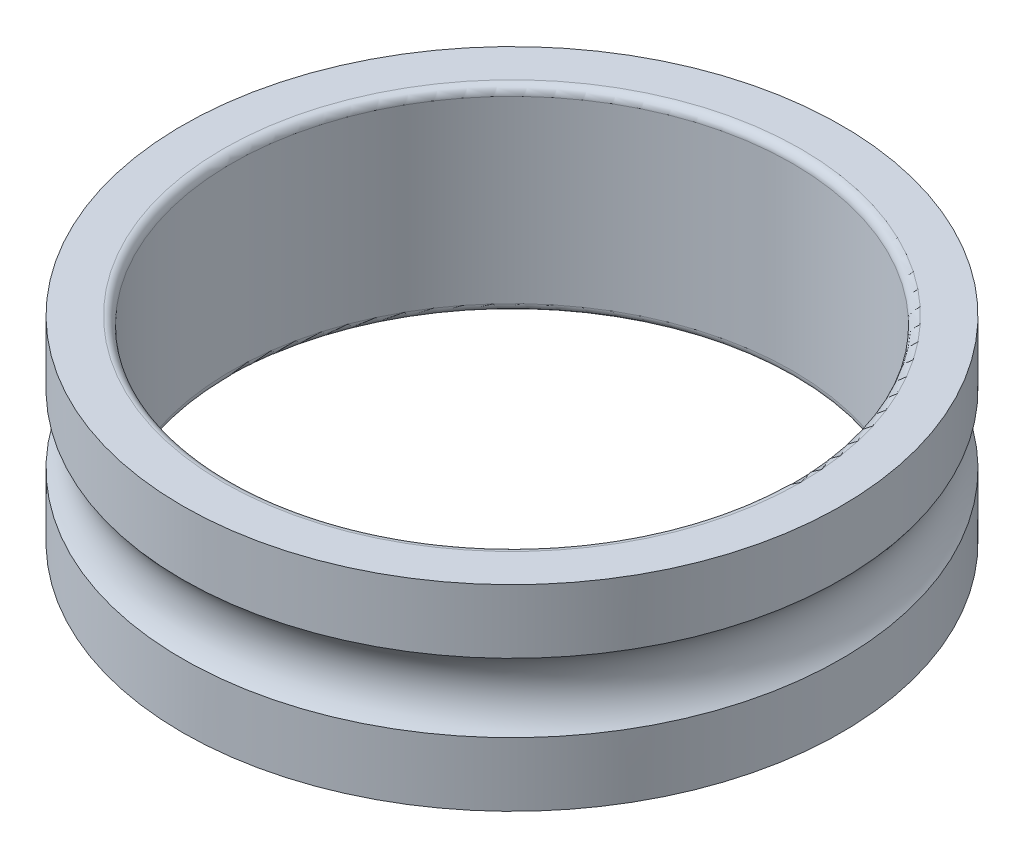
ISO-10303-21;
HEADER;
FILE_DESCRIPTION(('STEP AP214'),'2;1');
FILE_NAME('part.step','',(''),(''),'','','');
FILE_SCHEMA(('AUTOMOTIVE_DESIGN { 1 0 10303 214 1 1 1 1 }'));
ENDSEC;
DATA;
#1=APPLICATION_CONTEXT('core data for automotive mechanical design processes');
#2=APPLICATION_PROTOCOL_DEFINITION('international standard','automotive_design',2000,#1);
#3=PRODUCT_CONTEXT('',#1,'mechanical');
#4=PRODUCT('Part','Part','',(#3));
#5=PRODUCT_RELATED_PRODUCT_CATEGORY('part','',(#4));
#6=PRODUCT_DEFINITION_FORMATION('','',#4);
#7=PRODUCT_DEFINITION_CONTEXT('part definition',#1,'design');
#8=PRODUCT_DEFINITION('design','',#6,#7);
#9=PRODUCT_DEFINITION_SHAPE('','',#8);
#10=(LENGTH_UNIT() NAMED_UNIT(*) SI_UNIT(.MILLI.,.METRE.));
#11=(NAMED_UNIT(*) PLANE_ANGLE_UNIT() SI_UNIT($,.RADIAN.));
#12=(NAMED_UNIT(*) SI_UNIT($,.STERADIAN.) SOLID_ANGLE_UNIT());
#13=UNCERTAINTY_MEASURE_WITH_UNIT(LENGTH_MEASURE(1.E-05),#10,'distance_accuracy_value','');
#14=(GEOMETRIC_REPRESENTATION_CONTEXT(3) GLOBAL_UNCERTAINTY_ASSIGNED_CONTEXT((#13)) GLOBAL_UNIT_ASSIGNED_CONTEXT((#10,
#11,#12)) REPRESENTATION_CONTEXT('',''));
#15=CARTESIAN_POINT('',(0.,0.,0.));
#16=DIRECTION('',(0.,0.,1.));
#17=DIRECTION('',(1.,0.,0.));
#18=AXIS2_PLACEMENT_3D('',#15,#16,#17);
#19=CARTESIAN_POINT('',(0.,-3.5,0.));
#20=DIRECTION('',(0.,1.,0.));
#21=DIRECTION('',(1.,0.,0.));
#22=AXIS2_PLACEMENT_3D('',#19,#20,#21);
#23=PLANE('',#22);
#24=CARTESIAN_POINT('',(0.,-3.5,0.));
#25=DIRECTION('',(0.,-1.,0.));
#26=DIRECTION('',(0.,0.,1.));
#27=AXIS2_PLACEMENT_3D('',#24,#25,#26);
#28=CIRCLE('',#27,10.3);
#29=CARTESIAN_POINT('',(0.,-3.5,-10.3));
#30=VERTEX_POINT('',#29);
#31=EDGE_CURVE('E21',#30,#30,#28,.T.);
#32=ORIENTED_EDGE('',*,*,#31,.F.);
#33=EDGE_LOOP('',(#32));
#34=FACE_BOUND('',#33,.T.);
#35=CARTESIAN_POINT('',(0.,-3.5,0.));
#36=DIRECTION('',(0.,1.,0.));
#37=DIRECTION('',(0.,0.,1.));
#38=AXIS2_PLACEMENT_3D('',#35,#36,#37);
#39=CIRCLE('',#38,11.75);
#40=CARTESIAN_POINT('',(0.,-3.5,11.75));
#41=VERTEX_POINT('',#40);
#42=EDGE_CURVE('E11',#41,#41,#39,.T.);
#43=ORIENTED_EDGE('',*,*,#42,.F.);
#44=EDGE_LOOP('',(#43));
#45=FACE_BOUND('',#44,.T.);
#46=ADVANCED_FACE('F17',(#34,#45),#23,.F.);
#47=CARTESIAN_POINT('',(0.,-3.85,0.));
#48=DIRECTION('',(0.,1.,0.));
#49=DIRECTION('',(0.,0.,-1.));
#50=AXIS2_PLACEMENT_3D('',#47,#48,#49);
#51=CYLINDRICAL_SURFACE('',#50,11.75);
#52=CARTESIAN_POINT('',(0.,-1.224744871392,0.));
#53=DIRECTION('',(0.,-1.,0.));
#54=DIRECTION('',(0.,0.,-1.));
#55=AXIS2_PLACEMENT_3D('',#52,#53,#54);
#56=CIRCLE('',#55,11.75);
#57=CARTESIAN_POINT('',(0.,-1.224744871392,-11.75));
#58=VERTEX_POINT('',#57);
#59=EDGE_CURVE('E28',#58,#58,#56,.T.);
#60=ORIENTED_EDGE('',*,*,#59,.T.);
#61=EDGE_LOOP('',(#60));
#62=FACE_BOUND('',#61,.T.);
#63=ORIENTED_EDGE('',*,*,#42,.T.);
#64=EDGE_LOOP('',(#63));
#65=FACE_BOUND('',#64,.T.);
#66=ADVANCED_FACE('F126',(#62,#65),#51,.T.);
#67=CARTESIAN_POINT('',(0.,0.,0.));
#68=DIRECTION('',(0.,1.,0.));
#69=DIRECTION('',(0.,0.,-1.));
#70=AXIS2_PLACEMENT_3D('',#67,#68,#69);
#71=TOROIDAL_SURFACE('',#70,13.,1.75);
#72=ORIENTED_EDGE('',*,*,#59,.F.);
#73=EDGE_LOOP('',(#72));
#74=FACE_BOUND('',#73,.T.);
#75=CARTESIAN_POINT('',(0.,1.224744871392,0.));
#76=DIRECTION('',(0.,1.,0.));
#77=DIRECTION('',(0.,0.,1.));
#78=AXIS2_PLACEMENT_3D('',#75,#76,#77);
#79=CIRCLE('',#78,11.75);
#80=CARTESIAN_POINT('',(0.,1.224744871392,11.75));
#81=VERTEX_POINT('',#80);
#82=EDGE_CURVE('E85',#81,#81,#79,.T.);
#83=ORIENTED_EDGE('',*,*,#82,.F.);
#84=EDGE_LOOP('',(#83));
#85=FACE_BOUND('',#84,.T.);
#86=ADVANCED_FACE('F149',(#74,#85),#71,.F.);
#87=CARTESIAN_POINT('',(0.,-3.85,0.));
#88=DIRECTION('',(0.,1.,0.));
#89=DIRECTION('',(0.,0.,-1.));
#90=AXIS2_PLACEMENT_3D('',#87,#88,#89);
#91=CYLINDRICAL_SURFACE('',#90,11.75);
#92=CARTESIAN_POINT('',(0.,3.5,0.));
#93=DIRECTION('',(0.,-1.,0.));
#94=DIRECTION('',(0.,0.,1.));
#95=AXIS2_PLACEMENT_3D('',#92,#93,#94);
#96=CIRCLE('',#95,11.75);
#97=CARTESIAN_POINT('',(0.,3.5,11.75));
#98=VERTEX_POINT('',#97);
#99=EDGE_CURVE('E70',#98,#98,#96,.T.);
#100=ORIENTED_EDGE('',*,*,#99,.T.);
#101=EDGE_LOOP('',(#100));
#102=FACE_BOUND('',#101,.T.);
#103=ORIENTED_EDGE('',*,*,#82,.T.);
#104=EDGE_LOOP('',(#103));
#105=FACE_BOUND('',#104,.T.);
#106=ADVANCED_FACE('F19',(#102,#105),#91,.T.);
#107=CARTESIAN_POINT('',(0.,3.5,0.));
#108=DIRECTION('',(0.,1.,0.));
#109=DIRECTION('',(1.,0.,0.));
#110=AXIS2_PLACEMENT_3D('',#107,#108,#109);
#111=PLANE('',#110);
#112=CARTESIAN_POINT('',(0.,3.5,0.));
#113=DIRECTION('',(0.,1.,0.));
#114=DIRECTION('',(0.,0.,1.));
#115=AXIS2_PLACEMENT_3D('',#112,#113,#114);
#116=CIRCLE('',#115,10.3);
#117=CARTESIAN_POINT('',(0.,3.5,10.3));
#118=VERTEX_POINT('',#117);
#119=EDGE_CURVE('E76',#118,#118,#116,.T.);
#120=ORIENTED_EDGE('',*,*,#119,.F.);
#121=EDGE_LOOP('',(#120));
#122=FACE_BOUND('',#121,.T.);
#123=ORIENTED_EDGE('',*,*,#99,.F.);
#124=EDGE_LOOP('',(#123));
#125=FACE_BOUND('',#124,.T.);
#126=ADVANCED_FACE('F111',(#122,#125),#111,.T.);
#127=CARTESIAN_POINT('',(0.,3.2,0.));
#128=DIRECTION('',(0.,1.,0.));
#129=DIRECTION('',(0.,0.,-1.));
#130=AXIS2_PLACEMENT_3D('',#127,#128,#129);
#131=TOROIDAL_SURFACE('',#130,10.3,0.3);
#132=CARTESIAN_POINT('',(0.,3.2,0.));
#133=DIRECTION('',(0.,1.,0.));
#134=DIRECTION('',(0.,0.,1.));
#135=AXIS2_PLACEMENT_3D('',#132,#133,#134);
#136=CIRCLE('',#135,10.);
#137=CARTESIAN_POINT('',(0.,3.2,-10.));
#138=VERTEX_POINT('',#137);
#139=EDGE_CURVE('E80',#138,#138,#136,.T.);
#140=ORIENTED_EDGE('',*,*,#139,.F.);
#141=EDGE_LOOP('',(#140));
#142=FACE_BOUND('',#141,.T.);
#143=ORIENTED_EDGE('',*,*,#119,.T.);
#144=EDGE_LOOP('',(#143));
#145=FACE_BOUND('',#144,.T.);
#146=ADVANCED_FACE('F77',(#142,#145),#131,.T.);
#147=CARTESIAN_POINT('',(0.,-3.85,0.));
#148=DIRECTION('',(0.,1.,0.));
#149=DIRECTION('',(0.,0.,-1.));
#150=AXIS2_PLACEMENT_3D('',#147,#148,#149);
#151=CYLINDRICAL_SURFACE('',#150,10.);
#152=ORIENTED_EDGE('',*,*,#139,.T.);
#153=EDGE_LOOP('',(#152));
#154=FACE_BOUND('',#153,.T.);
#155=CARTESIAN_POINT('',(0.,-3.2,0.));
#156=DIRECTION('',(0.,-1.,0.));
#157=DIRECTION('',(0.,0.,1.));
#158=AXIS2_PLACEMENT_3D('',#155,#156,#157);
#159=CIRCLE('',#158,10.);
#160=CARTESIAN_POINT('',(0.,-3.2,-10.));
#161=VERTEX_POINT('',#160);
#162=EDGE_CURVE('E62',#161,#161,#159,.T.);
#163=ORIENTED_EDGE('',*,*,#162,.T.);
#164=EDGE_LOOP('',(#163));
#165=FACE_BOUND('',#164,.T.);
#166=ADVANCED_FACE('F104',(#154,#165),#151,.F.);
#167=CARTESIAN_POINT('',(0.,-3.2,0.));
#168=DIRECTION('',(0.,1.,0.));
#169=DIRECTION('',(0.,0.,-1.));
#170=AXIS2_PLACEMENT_3D('',#167,#168,#169);
#171=TOROIDAL_SURFACE('',#170,10.3,0.3);
#172=ORIENTED_EDGE('',*,*,#31,.T.);
#173=EDGE_LOOP('',(#172));
#174=FACE_BOUND('',#173,.T.);
#175=ORIENTED_EDGE('',*,*,#162,.F.);
#176=EDGE_LOOP('',(#175));
#177=FACE_BOUND('',#176,.T.);
#178=ADVANCED_FACE('F99',(#174,#177),#171,.T.);
#179=CLOSED_SHELL('',(#46,#66,#86,#106,#126,#146,#166,#178));
#180=MANIFOLD_SOLID_BREP('B1',#179);
#181=ADVANCED_BREP_SHAPE_REPRESENTATION('',(#18,#180),#14);
#182=SHAPE_DEFINITION_REPRESENTATION(#9,#181);
ENDSEC;
END-ISO-10303-21;
